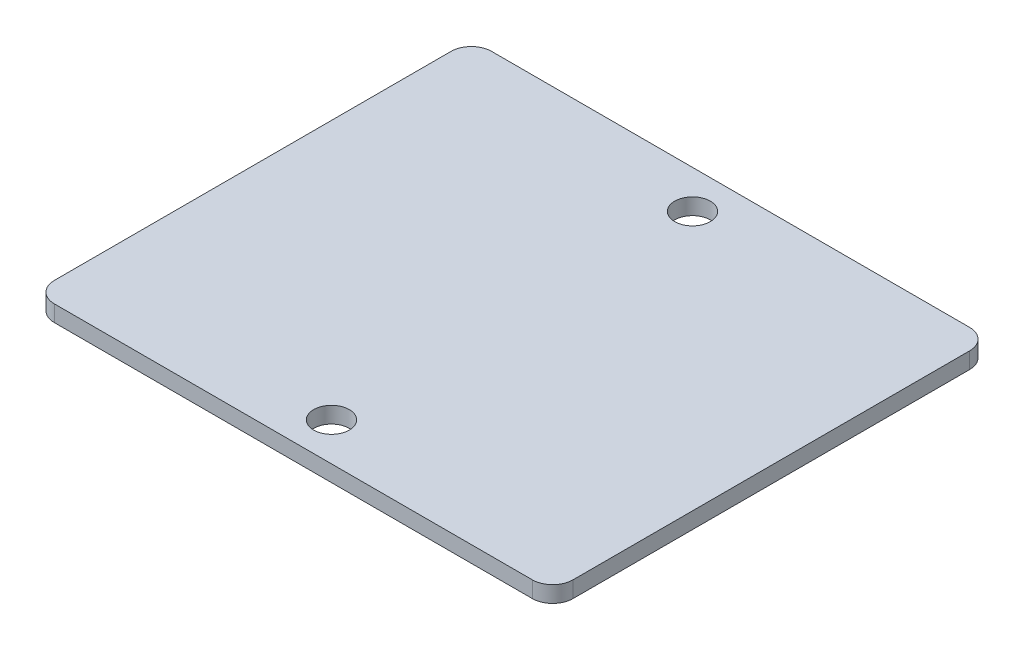
ISO-10303-21;
HEADER;
FILE_DESCRIPTION(('STEP AP214'),'2;1');
FILE_NAME('part.step','',(''),(''),'','','');
FILE_SCHEMA(('AUTOMOTIVE_DESIGN { 1 0 10303 214 1 1 1 1 }'));
ENDSEC;
DATA;
#1=APPLICATION_CONTEXT('core data for automotive mechanical design processes');
#2=APPLICATION_PROTOCOL_DEFINITION('international standard','automotive_design',2000,#1);
#3=PRODUCT_CONTEXT('',#1,'mechanical');
#4=PRODUCT('Part','Part','',(#3));
#5=PRODUCT_RELATED_PRODUCT_CATEGORY('part','',(#4));
#6=PRODUCT_DEFINITION_FORMATION('','',#4);
#7=PRODUCT_DEFINITION_CONTEXT('part definition',#1,'design');
#8=PRODUCT_DEFINITION('design','',#6,#7);
#9=PRODUCT_DEFINITION_SHAPE('','',#8);
#10=(LENGTH_UNIT() NAMED_UNIT(*) SI_UNIT(.MILLI.,.METRE.));
#11=(NAMED_UNIT(*) PLANE_ANGLE_UNIT() SI_UNIT($,.RADIAN.));
#12=(NAMED_UNIT(*) SI_UNIT($,.STERADIAN.) SOLID_ANGLE_UNIT());
#13=UNCERTAINTY_MEASURE_WITH_UNIT(LENGTH_MEASURE(1.E-05),#10,'distance_accuracy_value','');
#14=(GEOMETRIC_REPRESENTATION_CONTEXT(3) GLOBAL_UNCERTAINTY_ASSIGNED_CONTEXT((#13)) GLOBAL_UNIT_ASSIGNED_CONTEXT((#10,
#11,#12)) REPRESENTATION_CONTEXT('',''));
#15=CARTESIAN_POINT('',(0.,0.,0.));
#16=DIRECTION('',(0.,0.,1.));
#17=DIRECTION('',(1.,0.,0.));
#18=AXIS2_PLACEMENT_3D('',#15,#16,#17);
#19=CARTESIAN_POINT('',(0.,1.6,0.));
#20=DIRECTION('',(0.,-1.,0.));
#21=DIRECTION('',(0.,0.,-1.));
#22=AXIS2_PLACEMENT_3D('',#19,#20,#21);
#23=PLANE('',#22);
#24=DIRECTION('',(-1.,0.,0.));
#25=VECTOR('',#24,1.);
#26=CARTESIAN_POINT('',(-25.5,1.6,-21.5));
#27=LINE('',#26,#25);
#28=CARTESIAN_POINT('',(23.5,1.6,-21.5));
#29=VERTEX_POINT('',#28);
#30=CARTESIAN_POINT('',(-23.5,1.6,-21.5));
#31=VERTEX_POINT('',#30);
#32=EDGE_CURVE('E171',#29,#31,#27,.T.);
#33=ORIENTED_EDGE('',*,*,#32,.T.);
#34=CARTESIAN_POINT('',(-23.5,1.6,-19.5));
#35=DIRECTION('',(0.,-1.,0.));
#36=DIRECTION('',(0.,0.,-1.));
#37=AXIS2_PLACEMENT_3D('',#34,#35,#36);
#38=CIRCLE('',#37,2.);
#39=CARTESIAN_POINT('',(-25.5,1.6,-19.5));
#40=VERTEX_POINT('',#39);
#41=EDGE_CURVE('E148',#31,#40,#38,.F.);
#42=ORIENTED_EDGE('',*,*,#41,.T.);
#43=DIRECTION('',(0.,0.,1.));
#44=VECTOR('',#43,1.);
#45=CARTESIAN_POINT('',(-25.5,1.6,21.5));
#46=LINE('',#45,#44);
#47=CARTESIAN_POINT('',(-25.5,1.6,19.5));
#48=VERTEX_POINT('',#47);
#49=EDGE_CURVE('E118',#40,#48,#46,.T.);
#50=ORIENTED_EDGE('',*,*,#49,.T.);
#51=CARTESIAN_POINT('',(-23.5,1.6,19.5));
#52=DIRECTION('',(0.,-1.,0.));
#53=DIRECTION('',(0.,0.,-1.));
#54=AXIS2_PLACEMENT_3D('',#51,#52,#53);
#55=CIRCLE('',#54,2.);
#56=CARTESIAN_POINT('',(-23.5,1.6,21.5));
#57=VERTEX_POINT('',#56);
#58=EDGE_CURVE('E55',#48,#57,#55,.F.);
#59=ORIENTED_EDGE('',*,*,#58,.T.);
#60=DIRECTION('',(1.,0.,0.));
#61=VECTOR('',#60,1.);
#62=CARTESIAN_POINT('',(-25.5,1.6,21.5));
#63=LINE('',#62,#61);
#64=CARTESIAN_POINT('',(23.5,1.6,21.5));
#65=VERTEX_POINT('',#64);
#66=EDGE_CURVE('E134',#57,#65,#63,.T.);
#67=ORIENTED_EDGE('',*,*,#66,.T.);
#68=CARTESIAN_POINT('',(23.5,1.6,19.5));
#69=DIRECTION('',(0.,-1.,0.));
#70=DIRECTION('',(0.,0.,-1.));
#71=AXIS2_PLACEMENT_3D('',#68,#69,#70);
#72=CIRCLE('',#71,2.);
#73=CARTESIAN_POINT('',(25.5,1.6,19.5));
#74=VERTEX_POINT('',#73);
#75=EDGE_CURVE('E143',#65,#74,#72,.F.);
#76=ORIENTED_EDGE('',*,*,#75,.T.);
#77=DIRECTION('',(0.,0.,-1.));
#78=VECTOR('',#77,1.);
#79=CARTESIAN_POINT('',(25.5,1.6,21.5));
#80=LINE('',#79,#78);
#81=CARTESIAN_POINT('',(25.5,1.6,-19.5));
#82=VERTEX_POINT('',#81);
#83=EDGE_CURVE('E128',#74,#82,#80,.T.);
#84=ORIENTED_EDGE('',*,*,#83,.T.);
#85=CARTESIAN_POINT('',(23.5,1.6,-19.5));
#86=DIRECTION('',(0.,-1.,0.));
#87=DIRECTION('',(0.,0.,-1.));
#88=AXIS2_PLACEMENT_3D('',#85,#86,#87);
#89=CIRCLE('',#88,2.);
#90=EDGE_CURVE('E145',#82,#29,#89,.F.);
#91=ORIENTED_EDGE('',*,*,#90,.T.);
#92=EDGE_LOOP('',(#33,#42,#50,#59,#67,#76,#84,#91));
#93=FACE_BOUND('',#92,.T.);
#94=CARTESIAN_POINT('',(0.,1.6,-17.75));
#95=DIRECTION('',(0.,1.,0.));
#96=DIRECTION('',(0.,0.,1.));
#97=AXIS2_PLACEMENT_3D('',#94,#95,#96);
#98=CIRCLE('',#97,1.75);
#99=CARTESIAN_POINT('',(0.,1.6,-16.));
#100=VERTEX_POINT('',#99);
#101=EDGE_CURVE('E164',#100,#100,#98,.T.);
#102=ORIENTED_EDGE('',*,*,#101,.F.);
#103=EDGE_LOOP('',(#102));
#104=FACE_BOUND('',#103,.T.);
#105=CARTESIAN_POINT('',(0.,1.6,17.75));
#106=DIRECTION('',(0.,1.,0.));
#107=DIRECTION('',(0.,0.,1.));
#108=AXIS2_PLACEMENT_3D('',#105,#106,#107);
#109=CIRCLE('',#108,1.75);
#110=CARTESIAN_POINT('',(0.,1.6,19.5));
#111=VERTEX_POINT('',#110);
#112=EDGE_CURVE('E176',#111,#111,#109,.T.);
#113=ORIENTED_EDGE('',*,*,#112,.F.);
#114=EDGE_LOOP('',(#113));
#115=FACE_BOUND('',#114,.T.);
#116=ADVANCED_FACE('F33',(#93,#104,#115),#23,.F.);
#117=CARTESIAN_POINT('',(0.,0.,0.));
#118=DIRECTION('',(0.,-1.,0.));
#119=DIRECTION('',(0.,0.,-1.));
#120=AXIS2_PLACEMENT_3D('',#117,#118,#119);
#121=PLANE('',#120);
#122=CARTESIAN_POINT('',(0.,0.,-17.75));
#123=DIRECTION('',(0.,1.,0.));
#124=DIRECTION('',(0.,0.,1.));
#125=AXIS2_PLACEMENT_3D('',#122,#123,#124);
#126=CIRCLE('',#125,1.75);
#127=CARTESIAN_POINT('',(0.,0.,-16.));
#128=VERTEX_POINT('',#127);
#129=EDGE_CURVE('E166',#128,#128,#126,.T.);
#130=ORIENTED_EDGE('',*,*,#129,.T.);
#131=EDGE_LOOP('',(#130));
#132=FACE_BOUND('',#131,.T.);
#133=DIRECTION('',(0.,0.,1.));
#134=VECTOR('',#133,1.);
#135=CARTESIAN_POINT('',(-25.5,0.,21.5));
#136=LINE('',#135,#134);
#137=CARTESIAN_POINT('',(-25.5,0.,-19.5));
#138=VERTEX_POINT('',#137);
#139=CARTESIAN_POINT('',(-25.5,0.,19.5));
#140=VERTEX_POINT('',#139);
#141=EDGE_CURVE('E116',#138,#140,#136,.T.);
#142=ORIENTED_EDGE('',*,*,#141,.F.);
#143=CARTESIAN_POINT('',(-23.5,0.,-19.5));
#144=DIRECTION('',(0.,-1.,0.));
#145=DIRECTION('',(0.,0.,-1.));
#146=AXIS2_PLACEMENT_3D('',#143,#144,#145);
#147=CIRCLE('',#146,2.);
#148=CARTESIAN_POINT('',(-23.5,0.,-21.5));
#149=VERTEX_POINT('',#148);
#150=EDGE_CURVE('E99',#138,#149,#147,.T.);
#151=ORIENTED_EDGE('',*,*,#150,.T.);
#152=DIRECTION('',(-1.,0.,0.));
#153=VECTOR('',#152,1.);
#154=CARTESIAN_POINT('',(-25.5,0.,-21.5));
#155=LINE('',#154,#153);
#156=CARTESIAN_POINT('',(23.5,0.,-21.5));
#157=VERTEX_POINT('',#156);
#158=EDGE_CURVE('E126',#157,#149,#155,.T.);
#159=ORIENTED_EDGE('',*,*,#158,.F.);
#160=CARTESIAN_POINT('',(23.5,0.,-19.5));
#161=DIRECTION('',(0.,-1.,0.));
#162=DIRECTION('',(0.,0.,-1.));
#163=AXIS2_PLACEMENT_3D('',#160,#161,#162);
#164=CIRCLE('',#163,2.);
#165=CARTESIAN_POINT('',(25.5,0.,-19.5));
#166=VERTEX_POINT('',#165);
#167=EDGE_CURVE('E137',#157,#166,#164,.T.);
#168=ORIENTED_EDGE('',*,*,#167,.T.);
#169=DIRECTION('',(0.,0.,-1.));
#170=VECTOR('',#169,1.);
#171=CARTESIAN_POINT('',(25.5,0.,21.5));
#172=LINE('',#171,#170);
#173=CARTESIAN_POINT('',(25.5,0.,19.5));
#174=VERTEX_POINT('',#173);
#175=EDGE_CURVE('E130',#174,#166,#172,.T.);
#176=ORIENTED_EDGE('',*,*,#175,.F.);
#177=CARTESIAN_POINT('',(23.5,0.,19.5));
#178=DIRECTION('',(0.,-1.,0.));
#179=DIRECTION('',(0.,0.,-1.));
#180=AXIS2_PLACEMENT_3D('',#177,#178,#179);
#181=CIRCLE('',#180,2.);
#182=CARTESIAN_POINT('',(23.5,0.,21.5));
#183=VERTEX_POINT('',#182);
#184=EDGE_CURVE('E119',#174,#183,#181,.T.);
#185=ORIENTED_EDGE('',*,*,#184,.T.);
#186=DIRECTION('',(1.,0.,0.));
#187=VECTOR('',#186,1.);
#188=CARTESIAN_POINT('',(-25.5,0.,21.5));
#189=LINE('',#188,#187);
#190=CARTESIAN_POINT('',(-23.5,0.,21.5));
#191=VERTEX_POINT('',#190);
#192=EDGE_CURVE('E125',#191,#183,#189,.T.);
#193=ORIENTED_EDGE('',*,*,#192,.F.);
#194=CARTESIAN_POINT('',(-23.5,0.,19.5));
#195=DIRECTION('',(0.,-1.,0.));
#196=DIRECTION('',(0.,0.,-1.));
#197=AXIS2_PLACEMENT_3D('',#194,#195,#196);
#198=CIRCLE('',#197,2.);
#199=EDGE_CURVE('E110',#191,#140,#198,.T.);
#200=ORIENTED_EDGE('',*,*,#199,.T.);
#201=EDGE_LOOP('',(#142,#151,#159,#168,#176,#185,#193,#200));
#202=FACE_BOUND('',#201,.T.);
#203=CARTESIAN_POINT('',(0.,0.,17.75));
#204=DIRECTION('',(0.,1.,0.));
#205=DIRECTION('',(0.,0.,1.));
#206=AXIS2_PLACEMENT_3D('',#203,#204,#205);
#207=CIRCLE('',#206,1.75);
#208=CARTESIAN_POINT('',(0.,0.,19.5));
#209=VERTEX_POINT('',#208);
#210=EDGE_CURVE('E178',#209,#209,#207,.T.);
#211=ORIENTED_EDGE('',*,*,#210,.T.);
#212=EDGE_LOOP('',(#211));
#213=FACE_BOUND('',#212,.T.);
#214=ADVANCED_FACE('F122',(#132,#202,#213),#121,.T.);
#215=CARTESIAN_POINT('',(25.5,1.6,21.5));
#216=DIRECTION('',(-1.,0.,0.));
#217=DIRECTION('',(0.,0.,1.));
#218=AXIS2_PLACEMENT_3D('',#215,#216,#217);
#219=PLANE('',#218);
#220=ORIENTED_EDGE('',*,*,#175,.T.);
#221=DIRECTION('',(0.,-1.,0.));
#222=VECTOR('',#221,1.);
#223=CARTESIAN_POINT('',(25.5,1.6,-19.5));
#224=LINE('',#223,#222);
#225=EDGE_CURVE('E11',#166,#82,#224,.F.);
#226=ORIENTED_EDGE('',*,*,#225,.T.);
#227=ORIENTED_EDGE('',*,*,#83,.F.);
#228=DIRECTION('',(0.,-1.,0.));
#229=VECTOR('',#228,1.);
#230=CARTESIAN_POINT('',(25.5,1.6,19.5));
#231=LINE('',#230,#229);
#232=EDGE_CURVE('E41',#74,#174,#231,.T.);
#233=ORIENTED_EDGE('',*,*,#232,.T.);
#234=EDGE_LOOP('',(#220,#226,#227,#233));
#235=FACE_BOUND('',#234,.T.);
#236=ADVANCED_FACE('F159',(#235),#219,.F.);
#237=CARTESIAN_POINT('',(-25.5,1.6,-21.5));
#238=DIRECTION('',(0.,0.,1.));
#239=DIRECTION('',(1.,0.,0.));
#240=AXIS2_PLACEMENT_3D('',#237,#238,#239);
#241=PLANE('',#240);
#242=ORIENTED_EDGE('',*,*,#158,.T.);
#243=DIRECTION('',(0.,-1.,0.));
#244=VECTOR('',#243,1.);
#245=CARTESIAN_POINT('',(-23.5,1.6,-21.5));
#246=LINE('',#245,#244);
#247=EDGE_CURVE('E104',#149,#31,#246,.F.);
#248=ORIENTED_EDGE('',*,*,#247,.T.);
#249=ORIENTED_EDGE('',*,*,#32,.F.);
#250=DIRECTION('',(0.,-1.,0.));
#251=VECTOR('',#250,1.);
#252=CARTESIAN_POINT('',(23.5,1.6,-21.5));
#253=LINE('',#252,#251);
#254=EDGE_CURVE('E109',#29,#157,#253,.T.);
#255=ORIENTED_EDGE('',*,*,#254,.T.);
#256=EDGE_LOOP('',(#242,#248,#249,#255));
#257=FACE_BOUND('',#256,.T.);
#258=ADVANCED_FACE('F204',(#257),#241,.F.);
#259=CARTESIAN_POINT('',(-25.5,1.6,21.5));
#260=DIRECTION('',(1.,0.,0.));
#261=DIRECTION('',(0.,0.,-1.));
#262=AXIS2_PLACEMENT_3D('',#259,#260,#261);
#263=PLANE('',#262);
#264=ORIENTED_EDGE('',*,*,#49,.F.);
#265=DIRECTION('',(0.,-1.,0.));
#266=VECTOR('',#265,1.);
#267=CARTESIAN_POINT('',(-25.5,1.6,-19.5));
#268=LINE('',#267,#266);
#269=EDGE_CURVE('E103',#40,#138,#268,.T.);
#270=ORIENTED_EDGE('',*,*,#269,.T.);
#271=ORIENTED_EDGE('',*,*,#141,.T.);
#272=DIRECTION('',(0.,-1.,0.));
#273=VECTOR('',#272,1.);
#274=CARTESIAN_POINT('',(-25.5,1.6,19.5));
#275=LINE('',#274,#273);
#276=EDGE_CURVE('E120',#140,#48,#275,.F.);
#277=ORIENTED_EDGE('',*,*,#276,.T.);
#278=EDGE_LOOP('',(#264,#270,#271,#277));
#279=FACE_BOUND('',#278,.T.);
#280=ADVANCED_FACE('F115',(#279),#263,.F.);
#281=CARTESIAN_POINT('',(-25.5,1.6,21.5));
#282=DIRECTION('',(0.,0.,-1.));
#283=DIRECTION('',(-1.,0.,0.));
#284=AXIS2_PLACEMENT_3D('',#281,#282,#283);
#285=PLANE('',#284);
#286=ORIENTED_EDGE('',*,*,#66,.F.);
#287=DIRECTION('',(0.,-1.,0.));
#288=VECTOR('',#287,1.);
#289=CARTESIAN_POINT('',(-23.5,1.6,21.5));
#290=LINE('',#289,#288);
#291=EDGE_CURVE('E151',#57,#191,#290,.T.);
#292=ORIENTED_EDGE('',*,*,#291,.T.);
#293=ORIENTED_EDGE('',*,*,#192,.T.);
#294=DIRECTION('',(0.,-1.,0.));
#295=VECTOR('',#294,1.);
#296=CARTESIAN_POINT('',(23.5,1.6,21.5));
#297=LINE('',#296,#295);
#298=EDGE_CURVE('E48',#183,#65,#297,.F.);
#299=ORIENTED_EDGE('',*,*,#298,.T.);
#300=EDGE_LOOP('',(#286,#292,#293,#299));
#301=FACE_BOUND('',#300,.T.);
#302=ADVANCED_FACE('F199',(#301),#285,.F.);
#303=CARTESIAN_POINT('',(0.,1.6,-17.75));
#304=DIRECTION('',(0.,-1.,0.));
#305=DIRECTION('',(0.,0.,-1.));
#306=AXIS2_PLACEMENT_3D('',#303,#304,#305);
#307=CYLINDRICAL_SURFACE('',#306,1.75);
#308=ORIENTED_EDGE('',*,*,#101,.T.);
#309=EDGE_LOOP('',(#308));
#310=FACE_BOUND('',#309,.T.);
#311=ORIENTED_EDGE('',*,*,#129,.F.);
#312=EDGE_LOOP('',(#311));
#313=FACE_BOUND('',#312,.T.);
#314=ADVANCED_FACE('F196',(#310,#313),#307,.F.);
#315=CARTESIAN_POINT('',(0.,1.6,17.75));
#316=DIRECTION('',(0.,-1.,0.));
#317=DIRECTION('',(0.,0.,-1.));
#318=AXIS2_PLACEMENT_3D('',#315,#316,#317);
#319=CYLINDRICAL_SURFACE('',#318,1.75);
#320=ORIENTED_EDGE('',*,*,#112,.T.);
#321=EDGE_LOOP('',(#320));
#322=FACE_BOUND('',#321,.T.);
#323=ORIENTED_EDGE('',*,*,#210,.F.);
#324=EDGE_LOOP('',(#323));
#325=FACE_BOUND('',#324,.T.);
#326=ADVANCED_FACE('F184',(#322,#325),#319,.F.);
#327=CARTESIAN_POINT('',(-23.5,1.6,-19.5));
#328=DIRECTION('',(0.,-1.,0.));
#329=DIRECTION('',(0.,0.,-1.));
#330=AXIS2_PLACEMENT_3D('',#327,#328,#329);
#331=CYLINDRICAL_SURFACE('',#330,2.);
#332=ORIENTED_EDGE('',*,*,#41,.F.);
#333=ORIENTED_EDGE('',*,*,#247,.F.);
#334=ORIENTED_EDGE('',*,*,#150,.F.);
#335=ORIENTED_EDGE('',*,*,#269,.F.);
#336=EDGE_LOOP('',(#332,#333,#334,#335));
#337=FACE_BOUND('',#336,.T.);
#338=ADVANCED_FACE('F102',(#337),#331,.T.);
#339=CARTESIAN_POINT('',(-23.5,1.6,19.5));
#340=DIRECTION('',(0.,-1.,0.));
#341=DIRECTION('',(0.,0.,-1.));
#342=AXIS2_PLACEMENT_3D('',#339,#340,#341);
#343=CYLINDRICAL_SURFACE('',#342,2.);
#344=ORIENTED_EDGE('',*,*,#58,.F.);
#345=ORIENTED_EDGE('',*,*,#276,.F.);
#346=ORIENTED_EDGE('',*,*,#199,.F.);
#347=ORIENTED_EDGE('',*,*,#291,.F.);
#348=EDGE_LOOP('',(#344,#345,#346,#347));
#349=FACE_BOUND('',#348,.T.);
#350=ADVANCED_FACE('F212',(#349),#343,.T.);
#351=CARTESIAN_POINT('',(23.5,1.6,-19.5));
#352=DIRECTION('',(0.,-1.,0.));
#353=DIRECTION('',(0.,0.,-1.));
#354=AXIS2_PLACEMENT_3D('',#351,#352,#353);
#355=CYLINDRICAL_SURFACE('',#354,2.);
#356=ORIENTED_EDGE('',*,*,#90,.F.);
#357=ORIENTED_EDGE('',*,*,#225,.F.);
#358=ORIENTED_EDGE('',*,*,#167,.F.);
#359=ORIENTED_EDGE('',*,*,#254,.F.);
#360=EDGE_LOOP('',(#356,#357,#358,#359));
#361=FACE_BOUND('',#360,.T.);
#362=ADVANCED_FACE('F214',(#361),#355,.T.);
#363=CARTESIAN_POINT('',(23.5,1.6,19.5));
#364=DIRECTION('',(0.,-1.,0.));
#365=DIRECTION('',(0.,0.,-1.));
#366=AXIS2_PLACEMENT_3D('',#363,#364,#365);
#367=CYLINDRICAL_SURFACE('',#366,2.);
#368=ORIENTED_EDGE('',*,*,#75,.F.);
#369=ORIENTED_EDGE('',*,*,#298,.F.);
#370=ORIENTED_EDGE('',*,*,#184,.F.);
#371=ORIENTED_EDGE('',*,*,#232,.F.);
#372=EDGE_LOOP('',(#368,#369,#370,#371));
#373=FACE_BOUND('',#372,.T.);
#374=ADVANCED_FACE('F35',(#373),#367,.T.);
#375=CLOSED_SHELL('',(#116,#214,#236,#258,#280,#302,#314,#326,#338,#350,#362,#374));
#376=MANIFOLD_SOLID_BREP('B2',#375);
#377=ADVANCED_BREP_SHAPE_REPRESENTATION('',(#18,#376),#14);
#378=SHAPE_DEFINITION_REPRESENTATION(#9,#377);
ENDSEC;
END-ISO-10303-21;
